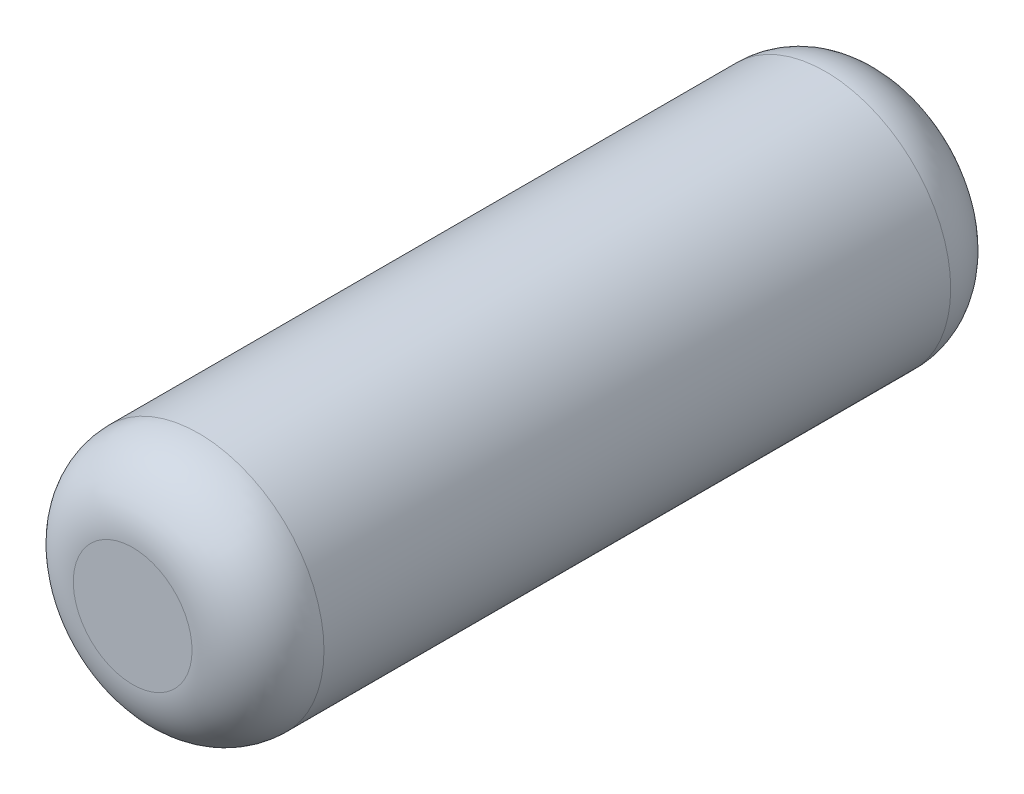
ISO-10303-21;
HEADER;
FILE_DESCRIPTION(('STEP AP214'),'2;1');
FILE_NAME('part.step','',(''),(''),'','','');
FILE_SCHEMA(('AUTOMOTIVE_DESIGN { 1 0 10303 214 1 1 1 1 }'));
ENDSEC;
DATA;
#1=APPLICATION_CONTEXT('core data for automotive mechanical design processes');
#2=APPLICATION_PROTOCOL_DEFINITION('international standard','automotive_design',2000,#1);
#3=PRODUCT_CONTEXT('',#1,'mechanical');
#4=PRODUCT('Part','Part','',(#3));
#5=PRODUCT_RELATED_PRODUCT_CATEGORY('part','',(#4));
#6=PRODUCT_DEFINITION_FORMATION('','',#4);
#7=PRODUCT_DEFINITION_CONTEXT('part definition',#1,'design');
#8=PRODUCT_DEFINITION('design','',#6,#7);
#9=PRODUCT_DEFINITION_SHAPE('','',#8);
#10=(LENGTH_UNIT() NAMED_UNIT(*) SI_UNIT(.MILLI.,.METRE.));
#11=(NAMED_UNIT(*) PLANE_ANGLE_UNIT() SI_UNIT($,.RADIAN.));
#12=(NAMED_UNIT(*) SI_UNIT($,.STERADIAN.) SOLID_ANGLE_UNIT());
#13=UNCERTAINTY_MEASURE_WITH_UNIT(LENGTH_MEASURE(1.E-05),#10,'distance_accuracy_value','');
#14=(GEOMETRIC_REPRESENTATION_CONTEXT(3) GLOBAL_UNCERTAINTY_ASSIGNED_CONTEXT((#13)) GLOBAL_UNIT_ASSIGNED_CONTEXT((#10,
#11,#12)) REPRESENTATION_CONTEXT('',''));
#15=CARTESIAN_POINT('',(0.,0.,0.));
#16=DIRECTION('',(0.,0.,1.));
#17=DIRECTION('',(1.,0.,0.));
#18=AXIS2_PLACEMENT_3D('',#15,#16,#17);
#19=CARTESIAN_POINT('',(0.,0.,292.1));
#20=DIRECTION('',(0.,0.,-1.));
#21=DIRECTION('',(-1.,0.,0.));
#22=AXIS2_PLACEMENT_3D('',#19,#20,#21);
#23=CYLINDRICAL_SURFACE('',#22,48.26);
#24=CARTESIAN_POINT('',(0.,0.,25.4));
#25=DIRECTION('',(0.,0.,1.));
#26=DIRECTION('',(1.,0.,0.));
#27=AXIS2_PLACEMENT_3D('',#24,#25,#26);
#28=CIRCLE('',#27,48.26);
#29=CARTESIAN_POINT('',(48.26,0.,25.4));
#30=VERTEX_POINT('',#29);
#31=EDGE_CURVE('E50',#30,#30,#28,.T.);
#32=ORIENTED_EDGE('',*,*,#31,.T.);
#33=EDGE_LOOP('',(#32));
#34=FACE_BOUND('',#33,.T.);
#35=CARTESIAN_POINT('',(0.,0.,266.7));
#36=DIRECTION('',(0.,0.,1.));
#37=DIRECTION('',(1.,0.,0.));
#38=AXIS2_PLACEMENT_3D('',#35,#36,#37);
#39=CIRCLE('',#38,48.26);
#40=CARTESIAN_POINT('',(48.26,0.,266.7));
#41=VERTEX_POINT('',#40);
#42=EDGE_CURVE('E55',#41,#41,#39,.F.);
#43=ORIENTED_EDGE('',*,*,#42,.T.);
#44=EDGE_LOOP('',(#43));
#45=FACE_BOUND('',#44,.T.);
#46=ADVANCED_FACE('F37',(#34,#45),#23,.T.);
#47=CARTESIAN_POINT('',(0.,0.,292.1));
#48=DIRECTION('',(0.,0.,1.));
#49=DIRECTION('',(1.,0.,0.));
#50=AXIS2_PLACEMENT_3D('',#47,#48,#49);
#51=PLANE('',#50);
#52=CARTESIAN_POINT('',(0.,0.,292.1));
#53=DIRECTION('',(0.,0.,1.));
#54=DIRECTION('',(1.,0.,0.));
#55=AXIS2_PLACEMENT_3D('',#52,#53,#54);
#56=CIRCLE('',#55,22.86);
#57=CARTESIAN_POINT('',(22.86,0.,292.1));
#58=VERTEX_POINT('',#57);
#59=EDGE_CURVE('E10',#58,#58,#56,.T.);
#60=ORIENTED_EDGE('',*,*,#59,.T.);
#61=EDGE_LOOP('',(#60));
#62=FACE_BOUND('',#61,.T.);
#63=ADVANCED_FACE('F72',(#62),#51,.T.);
#64=CARTESIAN_POINT('',(0.,0.,0.));
#65=DIRECTION('',(0.,0.,1.));
#66=DIRECTION('',(1.,0.,0.));
#67=AXIS2_PLACEMENT_3D('',#64,#65,#66);
#68=PLANE('',#67);
#69=CARTESIAN_POINT('',(0.,0.,0.));
#70=DIRECTION('',(0.,0.,1.));
#71=DIRECTION('',(1.,0.,0.));
#72=AXIS2_PLACEMENT_3D('',#69,#70,#71);
#73=CIRCLE('',#72,22.86);
#74=CARTESIAN_POINT('',(22.86,0.,0.));
#75=VERTEX_POINT('',#74);
#76=EDGE_CURVE('E45',#75,#75,#73,.F.);
#77=ORIENTED_EDGE('',*,*,#76,.T.);
#78=EDGE_LOOP('',(#77));
#79=FACE_BOUND('',#78,.T.);
#80=ADVANCED_FACE('F69',(#79),#68,.F.);
#81=CARTESIAN_POINT('',(0.,0.,25.4));
#82=DIRECTION('',(0.,0.,1.));
#83=DIRECTION('',(1.,0.,0.));
#84=AXIS2_PLACEMENT_3D('',#81,#82,#83);
#85=DEGENERATE_TOROIDAL_SURFACE('',#84,22.86,25.4,.T.);
#86=ORIENTED_EDGE('',*,*,#76,.F.);
#87=EDGE_LOOP('',(#86));
#88=FACE_BOUND('',#87,.T.);
#89=ORIENTED_EDGE('',*,*,#31,.F.);
#90=EDGE_LOOP('',(#89));
#91=FACE_BOUND('',#90,.T.);
#92=ADVANCED_FACE('F65',(#88,#91),#85,.T.);
#93=CARTESIAN_POINT('',(0.,0.,266.7));
#94=DIRECTION('',(0.,0.,1.));
#95=DIRECTION('',(1.,0.,0.));
#96=AXIS2_PLACEMENT_3D('',#93,#94,#95);
#97=DEGENERATE_TOROIDAL_SURFACE('',#96,22.86,25.4,.T.);
#98=ORIENTED_EDGE('',*,*,#42,.F.);
#99=EDGE_LOOP('',(#98));
#100=FACE_BOUND('',#99,.T.);
#101=ORIENTED_EDGE('',*,*,#59,.F.);
#102=EDGE_LOOP('',(#101));
#103=FACE_BOUND('',#102,.T.);
#104=ADVANCED_FACE('F39',(#100,#103),#97,.T.);
#105=CLOSED_SHELL('',(#46,#63,#80,#92,#104));
#106=MANIFOLD_SOLID_BREP('B2',#105);
#107=ADVANCED_BREP_SHAPE_REPRESENTATION('',(#18,#106),#14);
#108=SHAPE_DEFINITION_REPRESENTATION(#9,#107);
ENDSEC;
END-ISO-10303-21;
